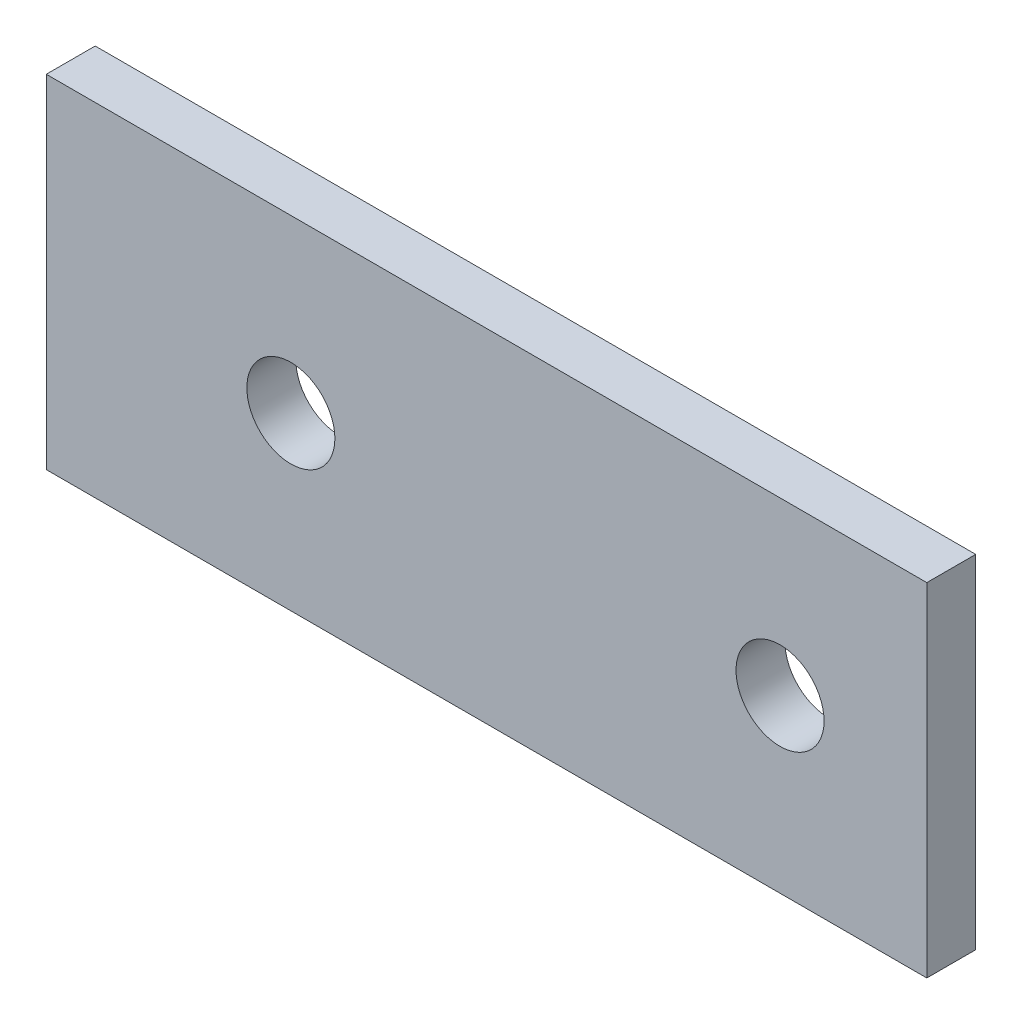
ISO-10303-21;
HEADER;
FILE_DESCRIPTION(('STEP AP214'),'2;1');
FILE_NAME('part.step','',(''),(''),'','','');
FILE_SCHEMA(('AUTOMOTIVE_DESIGN { 1 0 10303 214 1 1 1 1 }'));
ENDSEC;
DATA;
#1=APPLICATION_CONTEXT('core data for automotive mechanical design processes');
#2=APPLICATION_PROTOCOL_DEFINITION('international standard','automotive_design',2000,#1);
#3=PRODUCT_CONTEXT('',#1,'mechanical');
#4=PRODUCT('Part','Part','',(#3));
#5=PRODUCT_RELATED_PRODUCT_CATEGORY('part','',(#4));
#6=PRODUCT_DEFINITION_FORMATION('','',#4);
#7=PRODUCT_DEFINITION_CONTEXT('part definition',#1,'design');
#8=PRODUCT_DEFINITION('design','',#6,#7);
#9=PRODUCT_DEFINITION_SHAPE('','',#8);
#10=(LENGTH_UNIT() NAMED_UNIT(*) SI_UNIT(.MILLI.,.METRE.));
#11=(NAMED_UNIT(*) PLANE_ANGLE_UNIT() SI_UNIT($,.RADIAN.));
#12=(NAMED_UNIT(*) SI_UNIT($,.STERADIAN.) SOLID_ANGLE_UNIT());
#13=UNCERTAINTY_MEASURE_WITH_UNIT(LENGTH_MEASURE(1.E-05),#10,'distance_accuracy_value','');
#14=(GEOMETRIC_REPRESENTATION_CONTEXT(3) GLOBAL_UNCERTAINTY_ASSIGNED_CONTEXT((#13)) GLOBAL_UNIT_ASSIGNED_CONTEXT((#10,
#11,#12)) REPRESENTATION_CONTEXT('',''));
#15=CARTESIAN_POINT('',(0.,0.,0.));
#16=DIRECTION('',(0.,0.,1.));
#17=DIRECTION('',(1.,0.,0.));
#18=AXIS2_PLACEMENT_3D('',#15,#16,#17);
#19=CARTESIAN_POINT('',(0.,0.,5.));
#20=DIRECTION('',(0.,0.,1.));
#21=DIRECTION('',(1.,0.,0.));
#22=AXIS2_PLACEMENT_3D('',#19,#20,#21);
#23=PLANE('',#22);
#24=CARTESIAN_POINT('',(60.,0.,5.));
#25=DIRECTION('',(0.,0.,1.));
#26=DIRECTION('',(1.,0.,0.));
#27=AXIS2_PLACEMENT_3D('',#24,#25,#26);
#28=CIRCLE('',#27,9.);
#29=CARTESIAN_POINT('',(69.,0.,5.));
#30=VERTEX_POINT('',#29);
#31=EDGE_CURVE('E100',#30,#30,#28,.T.);
#32=ORIENTED_EDGE('',*,*,#31,.F.);
#33=EDGE_LOOP('',(#32));
#34=FACE_BOUND('',#33,.T.);
#35=DIRECTION('',(0.,1.,0.));
#36=VECTOR('',#35,1.);
#37=CARTESIAN_POINT('',(90.,35.,5.));
#38=LINE('',#37,#36);
#39=CARTESIAN_POINT('',(90.,-35.,5.));
#40=VERTEX_POINT('',#39);
#41=CARTESIAN_POINT('',(90.,35.,5.));
#42=VERTEX_POINT('',#41);
#43=EDGE_CURVE('E85',#40,#42,#38,.T.);
#44=ORIENTED_EDGE('',*,*,#43,.T.);
#45=DIRECTION('',(-1.,0.,0.));
#46=VECTOR('',#45,1.);
#47=CARTESIAN_POINT('',(-90.,35.,5.));
#48=LINE('',#47,#46);
#49=CARTESIAN_POINT('',(-90.,35.,5.));
#50=VERTEX_POINT('',#49);
#51=EDGE_CURVE('E80',#42,#50,#48,.T.);
#52=ORIENTED_EDGE('',*,*,#51,.T.);
#53=DIRECTION('',(0.,-1.,0.));
#54=VECTOR('',#53,1.);
#55=CARTESIAN_POINT('',(-90.,35.,5.));
#56=LINE('',#55,#54);
#57=CARTESIAN_POINT('',(-90.,-35.,5.));
#58=VERTEX_POINT('',#57);
#59=EDGE_CURVE('E83',#50,#58,#56,.T.);
#60=ORIENTED_EDGE('',*,*,#59,.T.);
#61=DIRECTION('',(1.,0.,0.));
#62=VECTOR('',#61,1.);
#63=CARTESIAN_POINT('',(-90.,-35.,5.));
#64=LINE('',#63,#62);
#65=EDGE_CURVE('E50',#58,#40,#64,.T.);
#66=ORIENTED_EDGE('',*,*,#65,.T.);
#67=EDGE_LOOP('',(#44,#52,#60,#66));
#68=FACE_BOUND('',#67,.T.);
#69=CARTESIAN_POINT('',(-40.,0.,5.));
#70=DIRECTION('',(0.,0.,1.));
#71=DIRECTION('',(1.,0.,0.));
#72=AXIS2_PLACEMENT_3D('',#69,#70,#71);
#73=CIRCLE('',#72,9.);
#74=CARTESIAN_POINT('',(-31.,0.,5.));
#75=VERTEX_POINT('',#74);
#76=EDGE_CURVE('E115',#75,#75,#73,.T.);
#77=ORIENTED_EDGE('',*,*,#76,.F.);
#78=EDGE_LOOP('',(#77));
#79=FACE_BOUND('',#78,.T.);
#80=ADVANCED_FACE('F33',(#34,#68,#79),#23,.T.);
#81=CARTESIAN_POINT('',(0.,0.,-5.));
#82=DIRECTION('',(0.,0.,1.));
#83=DIRECTION('',(1.,0.,0.));
#84=AXIS2_PLACEMENT_3D('',#81,#82,#83);
#85=PLANE('',#84);
#86=DIRECTION('',(0.,1.,0.));
#87=VECTOR('',#86,1.);
#88=CARTESIAN_POINT('',(90.,35.,-5.));
#89=LINE('',#88,#87);
#90=CARTESIAN_POINT('',(90.,-35.,-5.));
#91=VERTEX_POINT('',#90);
#92=CARTESIAN_POINT('',(90.,35.,-5.));
#93=VERTEX_POINT('',#92);
#94=EDGE_CURVE('E97',#91,#93,#89,.T.);
#95=ORIENTED_EDGE('',*,*,#94,.F.);
#96=DIRECTION('',(1.,0.,0.));
#97=VECTOR('',#96,1.);
#98=CARTESIAN_POINT('',(-90.,-35.,-5.));
#99=LINE('',#98,#97);
#100=CARTESIAN_POINT('',(-90.,-35.,-5.));
#101=VERTEX_POINT('',#100);
#102=EDGE_CURVE('E73',#101,#91,#99,.T.);
#103=ORIENTED_EDGE('',*,*,#102,.F.);
#104=DIRECTION('',(0.,-1.,0.));
#105=VECTOR('',#104,1.);
#106=CARTESIAN_POINT('',(-90.,35.,-5.));
#107=LINE('',#106,#105);
#108=CARTESIAN_POINT('',(-90.,35.,-5.));
#109=VERTEX_POINT('',#108);
#110=EDGE_CURVE('E67',#109,#101,#107,.T.);
#111=ORIENTED_EDGE('',*,*,#110,.F.);
#112=DIRECTION('',(-1.,0.,0.));
#113=VECTOR('',#112,1.);
#114=CARTESIAN_POINT('',(-90.,35.,-5.));
#115=LINE('',#114,#113);
#116=EDGE_CURVE('E89',#93,#109,#115,.T.);
#117=ORIENTED_EDGE('',*,*,#116,.F.);
#118=EDGE_LOOP('',(#95,#103,#111,#117));
#119=FACE_BOUND('',#118,.T.);
#120=CARTESIAN_POINT('',(60.,0.,-5.));
#121=DIRECTION('',(0.,0.,1.));
#122=DIRECTION('',(1.,0.,0.));
#123=AXIS2_PLACEMENT_3D('',#120,#121,#122);
#124=CIRCLE('',#123,9.);
#125=CARTESIAN_POINT('',(69.,0.,-5.));
#126=VERTEX_POINT('',#125);
#127=EDGE_CURVE('E112',#126,#126,#124,.T.);
#128=ORIENTED_EDGE('',*,*,#127,.T.);
#129=EDGE_LOOP('',(#128));
#130=FACE_BOUND('',#129,.T.);
#131=CARTESIAN_POINT('',(-40.,0.,-5.));
#132=DIRECTION('',(0.,0.,1.));
#133=DIRECTION('',(1.,0.,0.));
#134=AXIS2_PLACEMENT_3D('',#131,#132,#133);
#135=CIRCLE('',#134,9.);
#136=CARTESIAN_POINT('',(-31.,0.,-5.));
#137=VERTEX_POINT('',#136);
#138=EDGE_CURVE('E118',#137,#137,#135,.T.);
#139=ORIENTED_EDGE('',*,*,#138,.T.);
#140=EDGE_LOOP('',(#139));
#141=FACE_BOUND('',#140,.T.);
#142=ADVANCED_FACE('F108',(#119,#130,#141),#85,.F.);
#143=CARTESIAN_POINT('',(90.,35.,5.));
#144=DIRECTION('',(-1.,0.,0.));
#145=DIRECTION('',(0.,0.,1.));
#146=AXIS2_PLACEMENT_3D('',#143,#144,#145);
#147=PLANE('',#146);
#148=ORIENTED_EDGE('',*,*,#94,.T.);
#149=DIRECTION('',(0.,0.,-1.));
#150=VECTOR('',#149,1.);
#151=CARTESIAN_POINT('',(90.,35.,5.));
#152=LINE('',#151,#150);
#153=EDGE_CURVE('E11',#42,#93,#152,.T.);
#154=ORIENTED_EDGE('',*,*,#153,.F.);
#155=ORIENTED_EDGE('',*,*,#43,.F.);
#156=DIRECTION('',(0.,0.,-1.));
#157=VECTOR('',#156,1.);
#158=CARTESIAN_POINT('',(90.,-35.,5.));
#159=LINE('',#158,#157);
#160=EDGE_CURVE('E93',#40,#91,#159,.T.);
#161=ORIENTED_EDGE('',*,*,#160,.T.);
#162=EDGE_LOOP('',(#148,#154,#155,#161));
#163=FACE_BOUND('',#162,.T.);
#164=ADVANCED_FACE('F35',(#163),#147,.F.);
#165=CARTESIAN_POINT('',(-90.,35.,5.));
#166=DIRECTION('',(0.,-1.,0.));
#167=DIRECTION('',(0.,0.,-1.));
#168=AXIS2_PLACEMENT_3D('',#165,#166,#167);
#169=PLANE('',#168);
#170=ORIENTED_EDGE('',*,*,#116,.T.);
#171=DIRECTION('',(0.,0.,-1.));
#172=VECTOR('',#171,1.);
#173=CARTESIAN_POINT('',(-90.,35.,5.));
#174=LINE('',#173,#172);
#175=EDGE_CURVE('E42',#50,#109,#174,.T.);
#176=ORIENTED_EDGE('',*,*,#175,.F.);
#177=ORIENTED_EDGE('',*,*,#51,.F.);
#178=ORIENTED_EDGE('',*,*,#153,.T.);
#179=EDGE_LOOP('',(#170,#176,#177,#178));
#180=FACE_BOUND('',#179,.T.);
#181=ADVANCED_FACE('F88',(#180),#169,.F.);
#182=CARTESIAN_POINT('',(-90.,35.,5.));
#183=DIRECTION('',(1.,0.,0.));
#184=DIRECTION('',(0.,0.,-1.));
#185=AXIS2_PLACEMENT_3D('',#182,#183,#184);
#186=PLANE('',#185);
#187=ORIENTED_EDGE('',*,*,#110,.T.);
#188=DIRECTION('',(0.,0.,-1.));
#189=VECTOR('',#188,1.);
#190=CARTESIAN_POINT('',(-90.,-35.,5.));
#191=LINE('',#190,#189);
#192=EDGE_CURVE('E90',#58,#101,#191,.T.);
#193=ORIENTED_EDGE('',*,*,#192,.F.);
#194=ORIENTED_EDGE('',*,*,#59,.F.);
#195=ORIENTED_EDGE('',*,*,#175,.T.);
#196=EDGE_LOOP('',(#187,#193,#194,#195));
#197=FACE_BOUND('',#196,.T.);
#198=ADVANCED_FACE('F91',(#197),#186,.F.);
#199=CARTESIAN_POINT('',(-90.,-35.,5.));
#200=DIRECTION('',(0.,1.,0.));
#201=DIRECTION('',(0.,0.,1.));
#202=AXIS2_PLACEMENT_3D('',#199,#200,#201);
#203=PLANE('',#202);
#204=ORIENTED_EDGE('',*,*,#102,.T.);
#205=ORIENTED_EDGE('',*,*,#160,.F.);
#206=ORIENTED_EDGE('',*,*,#65,.F.);
#207=ORIENTED_EDGE('',*,*,#192,.T.);
#208=EDGE_LOOP('',(#204,#205,#206,#207));
#209=FACE_BOUND('',#208,.T.);
#210=ADVANCED_FACE('F105',(#209),#203,.F.);
#211=CARTESIAN_POINT('',(60.,0.,5.));
#212=DIRECTION('',(0.,0.,-1.));
#213=DIRECTION('',(-1.,0.,0.));
#214=AXIS2_PLACEMENT_3D('',#211,#212,#213);
#215=CYLINDRICAL_SURFACE('',#214,9.);
#216=ORIENTED_EDGE('',*,*,#31,.T.);
#217=EDGE_LOOP('',(#216));
#218=FACE_BOUND('',#217,.T.);
#219=ORIENTED_EDGE('',*,*,#127,.F.);
#220=EDGE_LOOP('',(#219));
#221=FACE_BOUND('',#220,.T.);
#222=ADVANCED_FACE('F135',(#218,#221),#215,.F.);
#223=CARTESIAN_POINT('',(-40.,0.,5.));
#224=DIRECTION('',(0.,0.,-1.));
#225=DIRECTION('',(-1.,0.,0.));
#226=AXIS2_PLACEMENT_3D('',#223,#224,#225);
#227=CYLINDRICAL_SURFACE('',#226,9.);
#228=ORIENTED_EDGE('',*,*,#76,.T.);
#229=EDGE_LOOP('',(#228));
#230=FACE_BOUND('',#229,.T.);
#231=ORIENTED_EDGE('',*,*,#138,.F.);
#232=EDGE_LOOP('',(#231));
#233=FACE_BOUND('',#232,.T.);
#234=ADVANCED_FACE('F124',(#230,#233),#227,.F.);
#235=CLOSED_SHELL('',(#80,#142,#164,#181,#198,#210,#222,#234));
#236=MANIFOLD_SOLID_BREP('B2',#235);
#237=ADVANCED_BREP_SHAPE_REPRESENTATION('',(#18,#236),#14);
#238=SHAPE_DEFINITION_REPRESENTATION(#9,#237);
ENDSEC;
END-ISO-10303-21;
